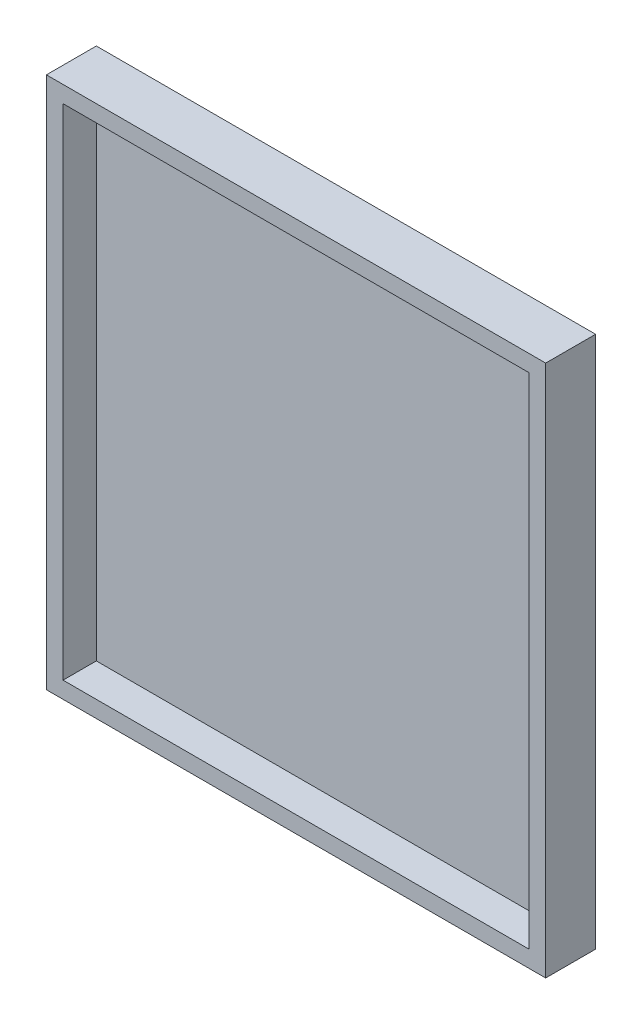
ISO-10303-21;
HEADER;
FILE_DESCRIPTION(('STEP AP214'),'2;1');
FILE_NAME('part.step','',(''),(''),'','','');
FILE_SCHEMA(('AUTOMOTIVE_DESIGN { 1 0 10303 214 1 1 1 1 }'));
ENDSEC;
DATA;
#1=APPLICATION_CONTEXT('core data for automotive mechanical design processes');
#2=APPLICATION_PROTOCOL_DEFINITION('international standard','automotive_design',2000,#1);
#3=PRODUCT_CONTEXT('',#1,'mechanical');
#4=PRODUCT('Part','Part','',(#3));
#5=PRODUCT_RELATED_PRODUCT_CATEGORY('part','',(#4));
#6=PRODUCT_DEFINITION_FORMATION('','',#4);
#7=PRODUCT_DEFINITION_CONTEXT('part definition',#1,'design');
#8=PRODUCT_DEFINITION('design','',#6,#7);
#9=PRODUCT_DEFINITION_SHAPE('','',#8);
#10=(LENGTH_UNIT() NAMED_UNIT(*) SI_UNIT(.MILLI.,.METRE.));
#11=(NAMED_UNIT(*) PLANE_ANGLE_UNIT() SI_UNIT($,.RADIAN.));
#12=(NAMED_UNIT(*) SI_UNIT($,.STERADIAN.) SOLID_ANGLE_UNIT());
#13=UNCERTAINTY_MEASURE_WITH_UNIT(LENGTH_MEASURE(1.E-05),#10,'distance_accuracy_value','');
#14=(GEOMETRIC_REPRESENTATION_CONTEXT(3) GLOBAL_UNCERTAINTY_ASSIGNED_CONTEXT((#13)) GLOBAL_UNIT_ASSIGNED_CONTEXT((#10,
#11,#12)) REPRESENTATION_CONTEXT('',''));
#15=CARTESIAN_POINT('',(0.,0.,0.));
#16=DIRECTION('',(0.,0.,1.));
#17=DIRECTION('',(1.,0.,0.));
#18=AXIS2_PLACEMENT_3D('',#15,#16,#17);
#19=CARTESIAN_POINT('',(0.,0.,0.));
#20=DIRECTION('',(0.,0.,1.));
#21=DIRECTION('',(1.,0.,0.));
#22=AXIS2_PLACEMENT_3D('',#19,#20,#21);
#23=PLANE('',#22);
#24=DIRECTION('',(1.,0.,0.));
#25=VECTOR('',#24,1.);
#26=CARTESIAN_POINT('',(0.,155.,0.));
#27=LINE('',#26,#25);
#28=CARTESIAN_POINT('',(5.,155.,0.));
#29=VERTEX_POINT('',#28);
#30=CARTESIAN_POINT('',(145.,155.,0.));
#31=VERTEX_POINT('',#30);
#32=EDGE_CURVE('E162',#29,#31,#27,.T.);
#33=ORIENTED_EDGE('',*,*,#32,.F.);
#34=DIRECTION('',(0.,1.,0.));
#35=VECTOR('',#34,1.);
#36=CARTESIAN_POINT('',(5.,155.,0.));
#37=LINE('',#36,#35);
#38=CARTESIAN_POINT('',(5.00000000000003,5.,0.));
#39=VERTEX_POINT('',#38);
#40=EDGE_CURVE('E123',#39,#29,#37,.T.);
#41=ORIENTED_EDGE('',*,*,#40,.F.);
#42=DIRECTION('',(-1.,0.,0.));
#43=VECTOR('',#42,1.);
#44=CARTESIAN_POINT('',(0.,5.,0.));
#45=LINE('',#44,#43);
#46=CARTESIAN_POINT('',(145.,5.,0.));
#47=VERTEX_POINT('',#46);
#48=EDGE_CURVE('E131',#47,#39,#45,.T.);
#49=ORIENTED_EDGE('',*,*,#48,.F.);
#50=DIRECTION('',(0.,-1.,0.));
#51=VECTOR('',#50,1.);
#52=CARTESIAN_POINT('',(145.,0.,0.));
#53=LINE('',#52,#51);
#54=EDGE_CURVE('E144',#31,#47,#53,.T.);
#55=ORIENTED_EDGE('',*,*,#54,.F.);
#56=EDGE_LOOP('',(#33,#41,#49,#55));
#57=FACE_BOUND('',#56,.T.);
#58=ADVANCED_FACE('F45',(#57),#23,.T.);
#59=CARTESIAN_POINT('',(0.,155.,10.));
#60=DIRECTION('',(0.,1.,0.));
#61=DIRECTION('',(0.,0.,1.));
#62=AXIS2_PLACEMENT_3D('',#59,#60,#61);
#63=PLANE('',#62);
#64=DIRECTION('',(0.,0.,-1.));
#65=VECTOR('',#64,1.);
#66=CARTESIAN_POINT('',(5.,155.,10.));
#67=LINE('',#66,#65);
#68=CARTESIAN_POINT('',(5.,155.,10.));
#69=VERTEX_POINT('',#68);
#70=EDGE_CURVE('E118',#69,#29,#67,.T.);
#71=ORIENTED_EDGE('',*,*,#70,.T.);
#72=ORIENTED_EDGE('',*,*,#32,.T.);
#73=DIRECTION('',(0.,0.,-1.));
#74=VECTOR('',#73,1.);
#75=CARTESIAN_POINT('',(145.,155.,10.));
#76=LINE('',#75,#74);
#77=CARTESIAN_POINT('',(145.,155.,10.));
#78=VERTEX_POINT('',#77);
#79=EDGE_CURVE('E155',#78,#31,#76,.T.);
#80=ORIENTED_EDGE('',*,*,#79,.F.);
#81=DIRECTION('',(1.,0.,0.));
#82=VECTOR('',#81,1.);
#83=CARTESIAN_POINT('',(0.,155.,10.));
#84=LINE('',#83,#82);
#85=EDGE_CURVE('E166',#69,#78,#84,.T.);
#86=ORIENTED_EDGE('',*,*,#85,.F.);
#87=EDGE_LOOP('',(#71,#72,#80,#86));
#88=FACE_BOUND('',#87,.T.);
#89=ADVANCED_FACE('F216',(#88),#63,.F.);
#90=CARTESIAN_POINT('',(0.,5.,10.));
#91=DIRECTION('',(0.,-1.,0.));
#92=DIRECTION('',(1.,0.,0.));
#93=AXIS2_PLACEMENT_3D('',#90,#91,#92);
#94=PLANE('',#93);
#95=DIRECTION('',(0.,0.,-1.));
#96=VECTOR('',#95,1.);
#97=CARTESIAN_POINT('',(5.00000000000003,5.,10.));
#98=LINE('',#97,#96);
#99=CARTESIAN_POINT('',(5.00000000000003,5.,10.));
#100=VERTEX_POINT('',#99);
#101=EDGE_CURVE('E115',#100,#39,#98,.T.);
#102=ORIENTED_EDGE('',*,*,#101,.F.);
#103=DIRECTION('',(-1.,0.,0.));
#104=VECTOR('',#103,1.);
#105=CARTESIAN_POINT('',(0.,5.,10.));
#106=LINE('',#105,#104);
#107=CARTESIAN_POINT('',(145.,5.,10.));
#108=VERTEX_POINT('',#107);
#109=EDGE_CURVE('E128',#108,#100,#106,.T.);
#110=ORIENTED_EDGE('',*,*,#109,.F.);
#111=DIRECTION('',(0.,0.,-1.));
#112=VECTOR('',#111,1.);
#113=CARTESIAN_POINT('',(145.,5.,10.));
#114=LINE('',#113,#112);
#115=EDGE_CURVE('E140',#108,#47,#114,.T.);
#116=ORIENTED_EDGE('',*,*,#115,.T.);
#117=ORIENTED_EDGE('',*,*,#48,.T.);
#118=EDGE_LOOP('',(#102,#110,#116,#117));
#119=FACE_BOUND('',#118,.T.);
#120=ADVANCED_FACE('F127',(#119),#94,.F.);
#121=CARTESIAN_POINT('',(145.,0.,10.));
#122=DIRECTION('',(1.,0.,0.));
#123=DIRECTION('',(0.,0.,-1.));
#124=AXIS2_PLACEMENT_3D('',#121,#122,#123);
#125=PLANE('',#124);
#126=ORIENTED_EDGE('',*,*,#115,.F.);
#127=DIRECTION('',(0.,-1.,0.));
#128=VECTOR('',#127,1.);
#129=CARTESIAN_POINT('',(145.,0.,10.));
#130=LINE('',#129,#128);
#131=EDGE_CURVE('E138',#78,#108,#130,.T.);
#132=ORIENTED_EDGE('',*,*,#131,.F.);
#133=ORIENTED_EDGE('',*,*,#79,.T.);
#134=ORIENTED_EDGE('',*,*,#54,.T.);
#135=EDGE_LOOP('',(#126,#132,#133,#134));
#136=FACE_BOUND('',#135,.T.);
#137=ADVANCED_FACE('F230',(#136),#125,.F.);
#138=CARTESIAN_POINT('',(0.,0.,-5.));
#139=DIRECTION('',(0.,-1.,0.));
#140=DIRECTION('',(0.,0.,-1.));
#141=AXIS2_PLACEMENT_3D('',#138,#139,#140);
#142=PLANE('',#141);
#143=DIRECTION('',(1.,0.,0.));
#144=VECTOR('',#143,1.);
#145=CARTESIAN_POINT('',(150.,0.,10.));
#146=LINE('',#145,#144);
#147=CARTESIAN_POINT('',(0.,0.,10.));
#148=VERTEX_POINT('',#147);
#149=CARTESIAN_POINT('',(150.,0.,10.));
#150=VERTEX_POINT('',#149);
#151=EDGE_CURVE('E151',#148,#150,#146,.T.);
#152=ORIENTED_EDGE('',*,*,#151,.F.);
#153=DIRECTION('',(0.,0.,1.));
#154=VECTOR('',#153,1.);
#155=CARTESIAN_POINT('',(0.,0.,-5.));
#156=LINE('',#155,#154);
#157=CARTESIAN_POINT('',(0.,0.,-5.));
#158=VERTEX_POINT('',#157);
#159=EDGE_CURVE('E11',#158,#148,#156,.T.);
#160=ORIENTED_EDGE('',*,*,#159,.F.);
#161=DIRECTION('',(1.,0.,0.));
#162=VECTOR('',#161,1.);
#163=CARTESIAN_POINT('',(0.,0.,-5.));
#164=LINE('',#163,#162);
#165=CARTESIAN_POINT('',(150.,0.,-5.));
#166=VERTEX_POINT('',#165);
#167=EDGE_CURVE('E177',#158,#166,#164,.T.);
#168=ORIENTED_EDGE('',*,*,#167,.T.);
#169=DIRECTION('',(0.,0.,1.));
#170=VECTOR('',#169,1.);
#171=CARTESIAN_POINT('',(150.,0.,-5.));
#172=LINE('',#171,#170);
#173=EDGE_CURVE('E49',#166,#150,#172,.T.);
#174=ORIENTED_EDGE('',*,*,#173,.T.);
#175=EDGE_LOOP('',(#152,#160,#168,#174));
#176=FACE_BOUND('',#175,.T.);
#177=ADVANCED_FACE('F47',(#176),#142,.T.);
#178=CARTESIAN_POINT('',(0.,0.,-5.));
#179=DIRECTION('',(1.,0.,0.));
#180=DIRECTION('',(0.,0.,-1.));
#181=AXIS2_PLACEMENT_3D('',#178,#179,#180);
#182=PLANE('',#181);
#183=ORIENTED_EDGE('',*,*,#159,.T.);
#184=DIRECTION('',(0.,-1.,0.));
#185=VECTOR('',#184,1.);
#186=CARTESIAN_POINT('',(0.,160.,10.));
#187=LINE('',#186,#185);
#188=CARTESIAN_POINT('',(0.,160.,10.));
#189=VERTEX_POINT('',#188);
#190=EDGE_CURVE('E163',#189,#148,#187,.T.);
#191=ORIENTED_EDGE('',*,*,#190,.F.);
#192=DIRECTION('',(0.,0.,1.));
#193=VECTOR('',#192,1.);
#194=CARTESIAN_POINT('',(0.,160.,-5.));
#195=LINE('',#194,#193);
#196=CARTESIAN_POINT('',(0.,160.,-5.));
#197=VERTEX_POINT('',#196);
#198=EDGE_CURVE('E55',#197,#189,#195,.T.);
#199=ORIENTED_EDGE('',*,*,#198,.F.);
#200=DIRECTION('',(0.,1.,0.));
#201=VECTOR('',#200,1.);
#202=CARTESIAN_POINT('',(0.,0.,-5.));
#203=LINE('',#202,#201);
#204=EDGE_CURVE('E68',#158,#197,#203,.T.);
#205=ORIENTED_EDGE('',*,*,#204,.F.);
#206=EDGE_LOOP('',(#183,#191,#199,#205));
#207=FACE_BOUND('',#206,.T.);
#208=ADVANCED_FACE('F203',(#207),#182,.F.);
#209=CARTESIAN_POINT('',(0.,160.,-5.));
#210=DIRECTION('',(0.,-1.,0.));
#211=DIRECTION('',(0.,0.,-1.));
#212=AXIS2_PLACEMENT_3D('',#209,#210,#211);
#213=PLANE('',#212);
#214=ORIENTED_EDGE('',*,*,#198,.T.);
#215=DIRECTION('',(-1.,0.,0.));
#216=VECTOR('',#215,1.);
#217=CARTESIAN_POINT('',(0.,160.,10.));
#218=LINE('',#217,#216);
#219=CARTESIAN_POINT('',(150.,160.,10.));
#220=VERTEX_POINT('',#219);
#221=EDGE_CURVE('E173',#220,#189,#218,.T.);
#222=ORIENTED_EDGE('',*,*,#221,.F.);
#223=DIRECTION('',(0.,0.,1.));
#224=VECTOR('',#223,1.);
#225=CARTESIAN_POINT('',(150.,160.,-5.));
#226=LINE('',#225,#224);
#227=CARTESIAN_POINT('',(150.,160.,-5.));
#228=VERTEX_POINT('',#227);
#229=EDGE_CURVE('E192',#228,#220,#226,.T.);
#230=ORIENTED_EDGE('',*,*,#229,.F.);
#231=DIRECTION('',(1.,0.,0.));
#232=VECTOR('',#231,1.);
#233=CARTESIAN_POINT('',(0.,160.,-5.));
#234=LINE('',#233,#232);
#235=EDGE_CURVE('E186',#197,#228,#234,.T.);
#236=ORIENTED_EDGE('',*,*,#235,.F.);
#237=EDGE_LOOP('',(#214,#222,#230,#236));
#238=FACE_BOUND('',#237,.T.);
#239=ADVANCED_FACE('F207',(#238),#213,.F.);
#240=CARTESIAN_POINT('',(150.,0.,-5.));
#241=DIRECTION('',(1.,0.,0.));
#242=DIRECTION('',(0.,0.,-1.));
#243=AXIS2_PLACEMENT_3D('',#240,#241,#242);
#244=PLANE('',#243);
#245=DIRECTION('',(0.,1.,0.));
#246=VECTOR('',#245,1.);
#247=CARTESIAN_POINT('',(150.,160.,10.));
#248=LINE('',#247,#246);
#249=EDGE_CURVE('E169',#150,#220,#248,.T.);
#250=ORIENTED_EDGE('',*,*,#249,.F.);
#251=ORIENTED_EDGE('',*,*,#173,.F.);
#252=DIRECTION('',(0.,1.,0.));
#253=VECTOR('',#252,1.);
#254=CARTESIAN_POINT('',(150.,0.,-5.));
#255=LINE('',#254,#253);
#256=EDGE_CURVE('E182',#166,#228,#255,.T.);
#257=ORIENTED_EDGE('',*,*,#256,.T.);
#258=ORIENTED_EDGE('',*,*,#229,.T.);
#259=EDGE_LOOP('',(#250,#251,#257,#258));
#260=FACE_BOUND('',#259,.T.);
#261=ADVANCED_FACE('F199',(#260),#244,.T.);
#262=CARTESIAN_POINT('',(0.,0.,-5.));
#263=DIRECTION('',(0.,0.,1.));
#264=DIRECTION('',(1.,0.,0.));
#265=AXIS2_PLACEMENT_3D('',#262,#263,#264);
#266=PLANE('',#265);
#267=ORIENTED_EDGE('',*,*,#167,.F.);
#268=ORIENTED_EDGE('',*,*,#204,.T.);
#269=ORIENTED_EDGE('',*,*,#235,.T.);
#270=ORIENTED_EDGE('',*,*,#256,.F.);
#271=EDGE_LOOP('',(#267,#268,#269,#270));
#272=FACE_BOUND('',#271,.T.);
#273=ADVANCED_FACE('F205',(#272),#266,.F.);
#274=CARTESIAN_POINT('',(0.,0.,10.));
#275=DIRECTION('',(0.,0.,1.));
#276=DIRECTION('',(1.,0.,0.));
#277=AXIS2_PLACEMENT_3D('',#274,#275,#276);
#278=PLANE('',#277);
#279=DIRECTION('',(0.,1.,0.));
#280=VECTOR('',#279,1.);
#281=CARTESIAN_POINT('',(5.,155.,10.));
#282=LINE('',#281,#280);
#283=EDGE_CURVE('E112',#100,#69,#282,.T.);
#284=ORIENTED_EDGE('',*,*,#283,.T.);
#285=ORIENTED_EDGE('',*,*,#85,.T.);
#286=ORIENTED_EDGE('',*,*,#131,.T.);
#287=ORIENTED_EDGE('',*,*,#109,.T.);
#288=EDGE_LOOP('',(#284,#285,#286,#287));
#289=FACE_BOUND('',#288,.T.);
#290=ORIENTED_EDGE('',*,*,#190,.T.);
#291=ORIENTED_EDGE('',*,*,#151,.T.);
#292=ORIENTED_EDGE('',*,*,#249,.T.);
#293=ORIENTED_EDGE('',*,*,#221,.T.);
#294=EDGE_LOOP('',(#290,#291,#292,#293));
#295=FACE_BOUND('',#294,.T.);
#296=ADVANCED_FACE('F135',(#289,#295),#278,.T.);
#297=CARTESIAN_POINT('',(5.,155.,10.));
#298=DIRECTION('',(-1.,0.,0.));
#299=DIRECTION('',(0.,-1.,0.));
#300=AXIS2_PLACEMENT_3D('',#297,#298,#299);
#301=PLANE('',#300);
#302=ORIENTED_EDGE('',*,*,#40,.T.);
#303=ORIENTED_EDGE('',*,*,#70,.F.);
#304=ORIENTED_EDGE('',*,*,#283,.F.);
#305=ORIENTED_EDGE('',*,*,#101,.T.);
#306=EDGE_LOOP('',(#302,#303,#304,#305));
#307=FACE_BOUND('',#306,.T.);
#308=ADVANCED_FACE('F114',(#307),#301,.F.);
#309=CLOSED_SHELL('',(#58,#89,#120,#137,#177,#208,#239,#261,#273,#296,#308));
#310=MANIFOLD_SOLID_BREP('B2',#309);
#311=ADVANCED_BREP_SHAPE_REPRESENTATION('',(#18,#310),#14);
#312=SHAPE_DEFINITION_REPRESENTATION(#9,#311);
ENDSEC;
END-ISO-10303-21;
